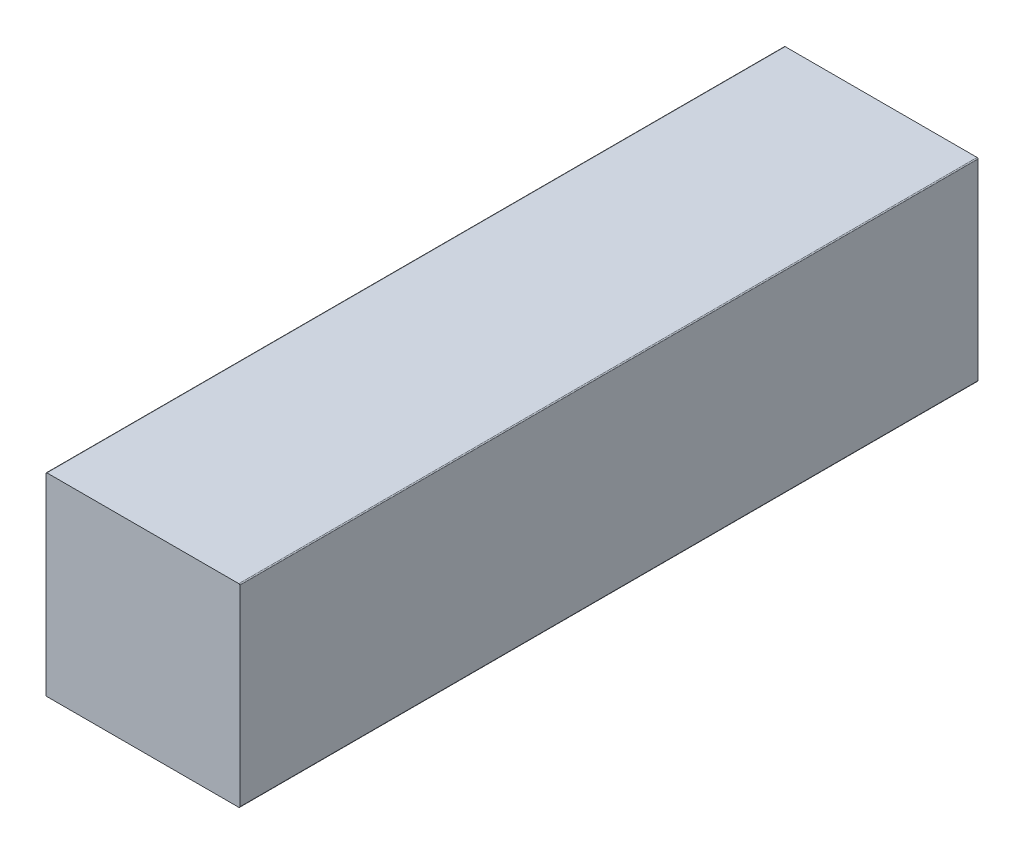
ISO-10303-21;
HEADER;
FILE_DESCRIPTION(('STEP AP214'),'2;1');
FILE_NAME('part.step','',(''),(''),'','','');
FILE_SCHEMA(('AUTOMOTIVE_DESIGN { 1 0 10303 214 1 1 1 1 }'));
ENDSEC;
DATA;
#1=APPLICATION_CONTEXT('core data for automotive mechanical design processes');
#2=APPLICATION_PROTOCOL_DEFINITION('international standard','automotive_design',2000,#1);
#3=PRODUCT_CONTEXT('',#1,'mechanical');
#4=PRODUCT('Part','Part','',(#3));
#5=PRODUCT_RELATED_PRODUCT_CATEGORY('part','',(#4));
#6=PRODUCT_DEFINITION_FORMATION('','',#4);
#7=PRODUCT_DEFINITION_CONTEXT('part definition',#1,'design');
#8=PRODUCT_DEFINITION('design','',#6,#7);
#9=PRODUCT_DEFINITION_SHAPE('','',#8);
#10=(LENGTH_UNIT() NAMED_UNIT(*) SI_UNIT(.MILLI.,.METRE.));
#11=(NAMED_UNIT(*) PLANE_ANGLE_UNIT() SI_UNIT($,.RADIAN.));
#12=(NAMED_UNIT(*) SI_UNIT($,.STERADIAN.) SOLID_ANGLE_UNIT());
#13=UNCERTAINTY_MEASURE_WITH_UNIT(LENGTH_MEASURE(1.E-05),#10,'distance_accuracy_value','');
#14=(GEOMETRIC_REPRESENTATION_CONTEXT(3) GLOBAL_UNCERTAINTY_ASSIGNED_CONTEXT((#13)) GLOBAL_UNIT_ASSIGNED_CONTEXT((#10,
#11,#12)) REPRESENTATION_CONTEXT('',''));
#15=CARTESIAN_POINT('',(0.,0.,0.));
#16=DIRECTION('',(0.,0.,1.));
#17=DIRECTION('',(1.,0.,0.));
#18=AXIS2_PLACEMENT_3D('',#15,#16,#17);
#19=CARTESIAN_POINT('',(2.5,-2.5,152.5));
#20=DIRECTION('',(0.,1.,0.));
#21=DIRECTION('',(0.,0.,1.));
#22=AXIS2_PLACEMENT_3D('',#19,#20,#21);
#23=PLANE('',#22);
#24=DIRECTION('',(0.,0.,-1.));
#25=VECTOR('',#24,1.);
#26=CARTESIAN_POINT('',(2.475,-2.5,152.5));
#27=LINE('',#26,#25);
#28=CARTESIAN_POINT('',(2.475,-2.5,-152.5));
#29=VERTEX_POINT('',#28);
#30=CARTESIAN_POINT('',(2.475,-2.5,-133.45));
#31=VERTEX_POINT('',#30);
#32=EDGE_CURVE('E157',#29,#31,#27,.F.);
#33=ORIENTED_EDGE('',*,*,#32,.T.);
#34=DIRECTION('',(1.,0.,0.));
#35=VECTOR('',#34,1.);
#36=CARTESIAN_POINT('',(-2.5,-2.5,-133.45));
#37=LINE('',#36,#35);
#38=CARTESIAN_POINT('',(-2.475,-2.5,-133.45));
#39=VERTEX_POINT('',#38);
#40=EDGE_CURVE('E107',#39,#31,#37,.T.);
#41=ORIENTED_EDGE('',*,*,#40,.F.);
#42=DIRECTION('',(0.,0.,-1.));
#43=VECTOR('',#42,1.);
#44=CARTESIAN_POINT('',(-2.475,-2.5,152.5));
#45=LINE('',#44,#43);
#46=CARTESIAN_POINT('',(-2.475,-2.5,-152.5));
#47=VERTEX_POINT('',#46);
#48=EDGE_CURVE('E154',#39,#47,#45,.T.);
#49=ORIENTED_EDGE('',*,*,#48,.T.);
#50=DIRECTION('',(1.,0.,0.));
#51=VECTOR('',#50,1.);
#52=CARTESIAN_POINT('',(2.5,-2.5,-152.5));
#53=LINE('',#52,#51);
#54=EDGE_CURVE('E171',#47,#29,#53,.T.);
#55=ORIENTED_EDGE('',*,*,#54,.T.);
#56=EDGE_LOOP('',(#33,#41,#49,#55));
#57=FACE_BOUND('',#56,.T.);
#58=ADVANCED_FACE('F39',(#57),#23,.F.);
#59=CARTESIAN_POINT('',(2.5,-2.5,152.5));
#60=DIRECTION('',(-1.,0.,0.));
#61=DIRECTION('',(0.,0.,1.));
#62=AXIS2_PLACEMENT_3D('',#59,#60,#61);
#63=PLANE('',#62);
#64=DIRECTION('',(0.,0.,-1.));
#65=VECTOR('',#64,1.);
#66=CARTESIAN_POINT('',(2.5,2.475,152.5));
#67=LINE('',#66,#65);
#68=CARTESIAN_POINT('',(2.5,2.475,-152.5));
#69=VERTEX_POINT('',#68);
#70=CARTESIAN_POINT('',(2.5,2.475,-133.45));
#71=VERTEX_POINT('',#70);
#72=EDGE_CURVE('E120',#69,#71,#67,.F.);
#73=ORIENTED_EDGE('',*,*,#72,.T.);
#74=DIRECTION('',(0.,1.,0.));
#75=VECTOR('',#74,1.);
#76=CARTESIAN_POINT('',(2.5,-2.5,-133.45));
#77=LINE('',#76,#75);
#78=CARTESIAN_POINT('',(2.5,-2.475,-133.45));
#79=VERTEX_POINT('',#78);
#80=EDGE_CURVE('E54',#79,#71,#77,.T.);
#81=ORIENTED_EDGE('',*,*,#80,.F.);
#82=DIRECTION('',(0.,0.,-1.));
#83=VECTOR('',#82,1.);
#84=CARTESIAN_POINT('',(2.5,-2.475,152.5));
#85=LINE('',#84,#83);
#86=CARTESIAN_POINT('',(2.5,-2.475,-152.5));
#87=VERTEX_POINT('',#86);
#88=EDGE_CURVE('E48',#79,#87,#85,.T.);
#89=ORIENTED_EDGE('',*,*,#88,.T.);
#90=DIRECTION('',(0.,1.,0.));
#91=VECTOR('',#90,1.);
#92=CARTESIAN_POINT('',(2.5,-2.5,-152.5));
#93=LINE('',#92,#91);
#94=EDGE_CURVE('E168',#87,#69,#93,.T.);
#95=ORIENTED_EDGE('',*,*,#94,.T.);
#96=EDGE_LOOP('',(#73,#81,#89,#95));
#97=FACE_BOUND('',#96,.T.);
#98=ADVANCED_FACE('F117',(#97),#63,.F.);
#99=CARTESIAN_POINT('',(2.5,2.5,152.5));
#100=DIRECTION('',(0.,-1.,0.));
#101=DIRECTION('',(0.,0.,-1.));
#102=AXIS2_PLACEMENT_3D('',#99,#100,#101);
#103=PLANE('',#102);
#104=DIRECTION('',(0.,0.,-1.));
#105=VECTOR('',#104,1.);
#106=CARTESIAN_POINT('',(-2.475,2.5,152.5));
#107=LINE('',#106,#105);
#108=CARTESIAN_POINT('',(-2.475,2.5,-152.5));
#109=VERTEX_POINT('',#108);
#110=CARTESIAN_POINT('',(-2.475,2.5,-133.45));
#111=VERTEX_POINT('',#110);
#112=EDGE_CURVE('E128',#109,#111,#107,.F.);
#113=ORIENTED_EDGE('',*,*,#112,.T.);
#114=DIRECTION('',(-1.,0.,0.));
#115=VECTOR('',#114,1.);
#116=CARTESIAN_POINT('',(-2.5,2.5,-133.45));
#117=LINE('',#116,#115);
#118=CARTESIAN_POINT('',(2.475,2.5,-133.45));
#119=VERTEX_POINT('',#118);
#120=EDGE_CURVE('E122',#119,#111,#117,.T.);
#121=ORIENTED_EDGE('',*,*,#120,.F.);
#122=DIRECTION('',(0.,0.,-1.));
#123=VECTOR('',#122,1.);
#124=CARTESIAN_POINT('',(2.475,2.5,152.5));
#125=LINE('',#124,#123);
#126=CARTESIAN_POINT('',(2.475,2.5,-152.5));
#127=VERTEX_POINT('',#126);
#128=EDGE_CURVE('E134',#119,#127,#125,.T.);
#129=ORIENTED_EDGE('',*,*,#128,.T.);
#130=DIRECTION('',(-1.,0.,0.));
#131=VECTOR('',#130,1.);
#132=CARTESIAN_POINT('',(2.5,2.5,-152.5));
#133=LINE('',#132,#131);
#134=EDGE_CURVE('E164',#127,#109,#133,.T.);
#135=ORIENTED_EDGE('',*,*,#134,.T.);
#136=EDGE_LOOP('',(#113,#121,#129,#135));
#137=FACE_BOUND('',#136,.T.);
#138=ADVANCED_FACE('F196',(#137),#103,.F.);
#139=CARTESIAN_POINT('',(-2.5,-2.5,152.5));
#140=DIRECTION('',(1.,0.,0.));
#141=DIRECTION('',(0.,0.,-1.));
#142=AXIS2_PLACEMENT_3D('',#139,#140,#141);
#143=PLANE('',#142);
#144=DIRECTION('',(0.,0.,-1.));
#145=VECTOR('',#144,1.);
#146=CARTESIAN_POINT('',(-2.5,-2.475,152.5));
#147=LINE('',#146,#145);
#148=CARTESIAN_POINT('',(-2.5,-2.475,-152.5));
#149=VERTEX_POINT('',#148);
#150=CARTESIAN_POINT('',(-2.5,-2.475,-133.45));
#151=VERTEX_POINT('',#150);
#152=EDGE_CURVE('E137',#149,#151,#147,.F.);
#153=ORIENTED_EDGE('',*,*,#152,.T.);
#154=DIRECTION('',(0.,-1.,0.));
#155=VECTOR('',#154,1.);
#156=CARTESIAN_POINT('',(-2.5,-2.5,-133.45));
#157=LINE('',#156,#155);
#158=CARTESIAN_POINT('',(-2.5,2.475,-133.45));
#159=VERTEX_POINT('',#158);
#160=EDGE_CURVE('E182',#159,#151,#157,.T.);
#161=ORIENTED_EDGE('',*,*,#160,.F.);
#162=DIRECTION('',(0.,0.,-1.));
#163=VECTOR('',#162,1.);
#164=CARTESIAN_POINT('',(-2.5,2.475,152.5));
#165=LINE('',#164,#163);
#166=CARTESIAN_POINT('',(-2.5,2.475,-152.5));
#167=VERTEX_POINT('',#166);
#168=EDGE_CURVE('E141',#159,#167,#165,.T.);
#169=ORIENTED_EDGE('',*,*,#168,.T.);
#170=DIRECTION('',(0.,-1.,0.));
#171=VECTOR('',#170,1.);
#172=CARTESIAN_POINT('',(-2.5,-2.5,-152.5));
#173=LINE('',#172,#171);
#174=EDGE_CURVE('E160',#167,#149,#173,.T.);
#175=ORIENTED_EDGE('',*,*,#174,.T.);
#176=EDGE_LOOP('',(#153,#161,#169,#175));
#177=FACE_BOUND('',#176,.T.);
#178=ADVANCED_FACE('F203',(#177),#143,.F.);
#179=CARTESIAN_POINT('',(0.,0.,-152.5));
#180=DIRECTION('',(0.,0.,-1.));
#181=DIRECTION('',(-1.,0.,0.));
#182=AXIS2_PLACEMENT_3D('',#179,#180,#181);
#183=PLANE('',#182);
#184=ORIENTED_EDGE('',*,*,#54,.F.);
#185=CARTESIAN_POINT('',(-2.475,-2.475,-152.5));
#186=DIRECTION('',(0.,0.,-1.));
#187=DIRECTION('',(-1.,0.,0.));
#188=AXIS2_PLACEMENT_3D('',#185,#186,#187);
#189=CIRCLE('',#188,0.025);
#190=EDGE_CURVE('E144',#47,#149,#189,.T.);
#191=ORIENTED_EDGE('',*,*,#190,.T.);
#192=ORIENTED_EDGE('',*,*,#174,.F.);
#193=CARTESIAN_POINT('',(-2.475,2.475,-152.5));
#194=DIRECTION('',(0.,0.,-1.));
#195=DIRECTION('',(-1.,0.,0.));
#196=AXIS2_PLACEMENT_3D('',#193,#194,#195);
#197=CIRCLE('',#196,0.025);
#198=EDGE_CURVE('E147',#167,#109,#197,.T.);
#199=ORIENTED_EDGE('',*,*,#198,.T.);
#200=ORIENTED_EDGE('',*,*,#134,.F.);
#201=CARTESIAN_POINT('',(2.475,2.475,-152.5));
#202=DIRECTION('',(0.,0.,-1.));
#203=DIRECTION('',(-1.,0.,0.));
#204=AXIS2_PLACEMENT_3D('',#201,#202,#203);
#205=CIRCLE('',#204,0.025);
#206=EDGE_CURVE('E62',#127,#69,#205,.T.);
#207=ORIENTED_EDGE('',*,*,#206,.T.);
#208=ORIENTED_EDGE('',*,*,#94,.F.);
#209=CARTESIAN_POINT('',(2.475,-2.475,-152.5));
#210=DIRECTION('',(0.,0.,-1.));
#211=DIRECTION('',(-1.,0.,0.));
#212=AXIS2_PLACEMENT_3D('',#209,#210,#211);
#213=CIRCLE('',#212,0.025);
#214=EDGE_CURVE('E125',#87,#29,#213,.T.);
#215=ORIENTED_EDGE('',*,*,#214,.T.);
#216=EDGE_LOOP('',(#184,#191,#192,#199,#200,#207,#208,#215));
#217=FACE_BOUND('',#216,.T.);
#218=ADVANCED_FACE('F198',(#217),#183,.T.);
#219=CARTESIAN_POINT('',(-2.475,-2.475,152.5));
#220=DIRECTION('',(0.,0.,-1.));
#221=DIRECTION('',(-1.,0.,0.));
#222=AXIS2_PLACEMENT_3D('',#219,#220,#221);
#223=CYLINDRICAL_SURFACE('',#222,0.025);
#224=CARTESIAN_POINT('',(-2.475,-2.475,-133.45));
#225=DIRECTION('',(0.,0.,-1.));
#226=DIRECTION('',(-1.,0.,0.));
#227=AXIS2_PLACEMENT_3D('',#224,#225,#226);
#228=CIRCLE('',#227,0.025);
#229=EDGE_CURVE('E175',#151,#39,#228,.F.);
#230=ORIENTED_EDGE('',*,*,#229,.F.);
#231=ORIENTED_EDGE('',*,*,#152,.F.);
#232=ORIENTED_EDGE('',*,*,#190,.F.);
#233=ORIENTED_EDGE('',*,*,#48,.F.);
#234=EDGE_LOOP('',(#230,#231,#232,#233));
#235=FACE_BOUND('',#234,.T.);
#236=ADVANCED_FACE('F206',(#235),#223,.T.);
#237=CARTESIAN_POINT('',(-2.475,2.475,152.5));
#238=DIRECTION('',(0.,0.,-1.));
#239=DIRECTION('',(-1.,0.,0.));
#240=AXIS2_PLACEMENT_3D('',#237,#238,#239);
#241=CYLINDRICAL_SURFACE('',#240,0.025);
#242=CARTESIAN_POINT('',(-2.475,2.475,-133.45));
#243=DIRECTION('',(0.,0.,-1.));
#244=DIRECTION('',(-1.,0.,0.));
#245=AXIS2_PLACEMENT_3D('',#242,#243,#244);
#246=CIRCLE('',#245,0.025);
#247=EDGE_CURVE('E113',#111,#159,#246,.F.);
#248=ORIENTED_EDGE('',*,*,#247,.F.);
#249=ORIENTED_EDGE('',*,*,#112,.F.);
#250=ORIENTED_EDGE('',*,*,#198,.F.);
#251=ORIENTED_EDGE('',*,*,#168,.F.);
#252=EDGE_LOOP('',(#248,#249,#250,#251));
#253=FACE_BOUND('',#252,.T.);
#254=ADVANCED_FACE('F194',(#253),#241,.T.);
#255=CARTESIAN_POINT('',(2.475,-2.475,152.5));
#256=DIRECTION('',(0.,0.,-1.));
#257=DIRECTION('',(-1.,0.,0.));
#258=AXIS2_PLACEMENT_3D('',#255,#256,#257);
#259=CYLINDRICAL_SURFACE('',#258,0.025);
#260=CARTESIAN_POINT('',(2.475,-2.475,-133.45));
#261=DIRECTION('',(0.,0.,-1.));
#262=DIRECTION('',(-1.,0.,0.));
#263=AXIS2_PLACEMENT_3D('',#260,#261,#262);
#264=CIRCLE('',#263,0.025);
#265=EDGE_CURVE('E104',#31,#79,#264,.F.);
#266=ORIENTED_EDGE('',*,*,#265,.F.);
#267=ORIENTED_EDGE('',*,*,#32,.F.);
#268=ORIENTED_EDGE('',*,*,#214,.F.);
#269=ORIENTED_EDGE('',*,*,#88,.F.);
#270=EDGE_LOOP('',(#266,#267,#268,#269));
#271=FACE_BOUND('',#270,.T.);
#272=ADVANCED_FACE('F124',(#271),#259,.T.);
#273=CARTESIAN_POINT('',(2.475,2.475,152.5));
#274=DIRECTION('',(0.,0.,-1.));
#275=DIRECTION('',(-1.,0.,0.));
#276=AXIS2_PLACEMENT_3D('',#273,#274,#275);
#277=CYLINDRICAL_SURFACE('',#276,0.025);
#278=CARTESIAN_POINT('',(2.475,2.475,-133.45));
#279=DIRECTION('',(0.,0.,-1.));
#280=DIRECTION('',(-1.,0.,0.));
#281=AXIS2_PLACEMENT_3D('',#278,#279,#280);
#282=CIRCLE('',#281,0.025);
#283=EDGE_CURVE('E11',#71,#119,#282,.F.);
#284=ORIENTED_EDGE('',*,*,#283,.F.);
#285=ORIENTED_EDGE('',*,*,#72,.F.);
#286=ORIENTED_EDGE('',*,*,#206,.F.);
#287=ORIENTED_EDGE('',*,*,#128,.F.);
#288=EDGE_LOOP('',(#284,#285,#286,#287));
#289=FACE_BOUND('',#288,.T.);
#290=ADVANCED_FACE('F41',(#289),#277,.T.);
#291=CARTESIAN_POINT('',(0.,0.,-133.45));
#292=DIRECTION('',(0.,0.,-1.));
#293=DIRECTION('',(-1.,0.,0.));
#294=AXIS2_PLACEMENT_3D('',#291,#292,#293);
#295=PLANE('',#294);
#296=ORIENTED_EDGE('',*,*,#229,.T.);
#297=ORIENTED_EDGE('',*,*,#40,.T.);
#298=ORIENTED_EDGE('',*,*,#265,.T.);
#299=ORIENTED_EDGE('',*,*,#80,.T.);
#300=ORIENTED_EDGE('',*,*,#283,.T.);
#301=ORIENTED_EDGE('',*,*,#120,.T.);
#302=ORIENTED_EDGE('',*,*,#247,.T.);
#303=ORIENTED_EDGE('',*,*,#160,.T.);
#304=EDGE_LOOP('',(#296,#297,#298,#299,#300,#301,#302,#303));
#305=FACE_BOUND('',#304,.T.);
#306=ADVANCED_FACE('F105',(#305),#295,.F.);
#307=CLOSED_SHELL('',(#58,#98,#138,#178,#218,#236,#254,#272,#290,#306));
#308=MANIFOLD_SOLID_BREP('B2',#307);
#309=ADVANCED_BREP_SHAPE_REPRESENTATION('',(#18,#308),#14);
#310=SHAPE_DEFINITION_REPRESENTATION(#9,#309);
ENDSEC;
END-ISO-10303-21;
